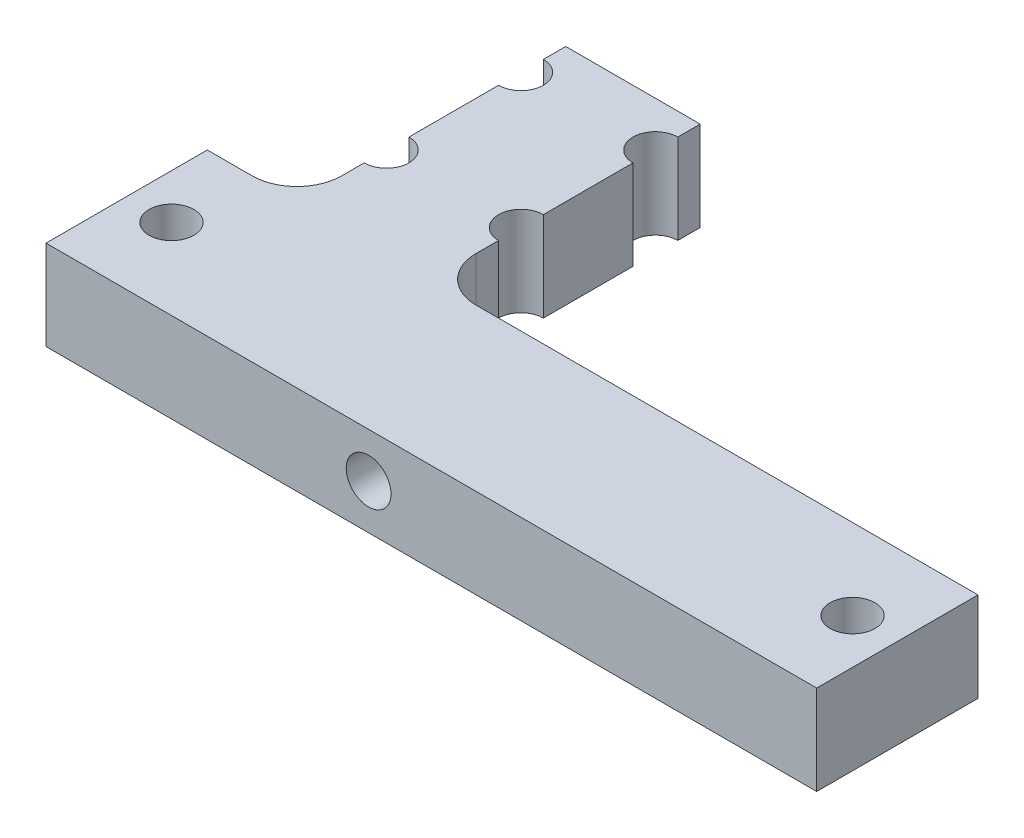
ISO-10303-21;
HEADER;
FILE_DESCRIPTION(('STEP AP214'),'2;1');
FILE_NAME('part.step','',(''),(''),'','','');
FILE_SCHEMA(('AUTOMOTIVE_DESIGN { 1 0 10303 214 1 1 1 1 }'));
ENDSEC;
DATA;
#1=APPLICATION_CONTEXT('core data for automotive mechanical design processes');
#2=APPLICATION_PROTOCOL_DEFINITION('international standard','automotive_design',2000,#1);
#3=PRODUCT_CONTEXT('',#1,'mechanical');
#4=PRODUCT('Part','Part','',(#3));
#5=PRODUCT_RELATED_PRODUCT_CATEGORY('part','',(#4));
#6=PRODUCT_DEFINITION_FORMATION('','',#4);
#7=PRODUCT_DEFINITION_CONTEXT('part definition',#1,'design');
#8=PRODUCT_DEFINITION('design','',#6,#7);
#9=PRODUCT_DEFINITION_SHAPE('','',#8);
#10=(LENGTH_UNIT() NAMED_UNIT(*) SI_UNIT(.MILLI.,.METRE.));
#11=(NAMED_UNIT(*) PLANE_ANGLE_UNIT() SI_UNIT($,.RADIAN.));
#12=(NAMED_UNIT(*) SI_UNIT($,.STERADIAN.) SOLID_ANGLE_UNIT());
#13=UNCERTAINTY_MEASURE_WITH_UNIT(LENGTH_MEASURE(1.E-05),#10,'distance_accuracy_value','');
#14=(GEOMETRIC_REPRESENTATION_CONTEXT(3) GLOBAL_UNCERTAINTY_ASSIGNED_CONTEXT((#13)) GLOBAL_UNIT_ASSIGNED_CONTEXT((#10,
#11,#12)) REPRESENTATION_CONTEXT('',''));
#15=CARTESIAN_POINT('',(0.,0.,0.));
#16=DIRECTION('',(0.,0.,1.));
#17=DIRECTION('',(1.,0.,0.));
#18=AXIS2_PLACEMENT_3D('',#15,#16,#17);
#19=CARTESIAN_POINT('',(-20.955,6.35,-12.065));
#20=DIRECTION('',(0.,1.,0.));
#21=DIRECTION('',(0.,0.,1.));
#22=AXIS2_PLACEMENT_3D('',#19,#20,#21);
#23=PLANE('',#22);
#24=CARTESIAN_POINT('',(-24.13,6.35,0.));
#25=DIRECTION('',(0.,1.,0.));
#26=DIRECTION('',(0.,0.,1.));
#27=AXIS2_PLACEMENT_3D('',#24,#25,#26);
#28=CIRCLE('',#27,1.5875);
#29=CARTESIAN_POINT('',(-24.13,6.35,1.5875));
#30=VERTEX_POINT('',#29);
#31=EDGE_CURVE('E316',#30,#30,#28,.T.);
#32=ORIENTED_EDGE('',*,*,#31,.F.);
#33=EDGE_LOOP('',(#32));
#34=FACE_BOUND('',#33,.T.);
#35=DIRECTION('',(0.,0.,-1.));
#36=VECTOR('',#35,1.);
#37=CARTESIAN_POINT('',(27.305,6.35,-5.715));
#38=LINE('',#37,#36);
#39=CARTESIAN_POINT('',(27.305,6.35,5.715));
#40=VERTEX_POINT('',#39);
#41=CARTESIAN_POINT('',(27.305,6.35,-5.715));
#42=VERTEX_POINT('',#41);
#43=EDGE_CURVE('E163',#40,#42,#38,.T.);
#44=ORIENTED_EDGE('',*,*,#43,.T.);
#45=DIRECTION('',(-1.,0.,0.));
#46=VECTOR('',#45,1.);
#47=CARTESIAN_POINT('',(-11.43,6.35,-5.715));
#48=LINE('',#47,#46);
#49=CARTESIAN_POINT('',(-8.25499999999999,6.35,-5.715));
#50=VERTEX_POINT('',#49);
#51=EDGE_CURVE('E154',#42,#50,#48,.T.);
#52=ORIENTED_EDGE('',*,*,#51,.T.);
#53=CARTESIAN_POINT('',(-8.25499999999999,6.35,-8.89));
#54=DIRECTION('',(0.,1.,0.));
#55=DIRECTION('',(0.,0.,1.));
#56=AXIS2_PLACEMENT_3D('',#53,#54,#55);
#57=CIRCLE('',#56,3.175);
#58=CARTESIAN_POINT('',(-11.43,6.35,-8.89));
#59=VERTEX_POINT('',#58);
#60=EDGE_CURVE('E11',#50,#59,#57,.F.);
#61=ORIENTED_EDGE('',*,*,#60,.T.);
#62=DIRECTION('',(0.,0.,-1.));
#63=VECTOR('',#62,1.);
#64=CARTESIAN_POINT('',(-11.43,6.35,-5.715));
#65=LINE('',#64,#63);
#66=CARTESIAN_POINT('',(-11.43,6.35,-10.4775));
#67=VERTEX_POINT('',#66);
#68=EDGE_CURVE('E162',#59,#67,#65,.T.);
#69=ORIENTED_EDGE('',*,*,#68,.T.);
#70=CARTESIAN_POINT('',(-11.43,6.35,-12.065));
#71=DIRECTION('',(0.,-1.,0.));
#72=DIRECTION('',(0.,0.,1.));
#73=AXIS2_PLACEMENT_3D('',#70,#71,#72);
#74=CIRCLE('',#73,1.5875);
#75=CARTESIAN_POINT('',(-11.43,6.35,-13.6525));
#76=VERTEX_POINT('',#75);
#77=EDGE_CURVE('E323',#67,#76,#74,.T.);
#78=ORIENTED_EDGE('',*,*,#77,.T.);
#79=DIRECTION('',(0.,0.,-1.));
#80=VECTOR('',#79,1.);
#81=CARTESIAN_POINT('',(-11.43,6.35,-13.6525));
#82=LINE('',#81,#80);
#83=CARTESIAN_POINT('',(-11.43,6.35,-20.0025));
#84=VERTEX_POINT('',#83);
#85=EDGE_CURVE('E273',#76,#84,#82,.T.);
#86=ORIENTED_EDGE('',*,*,#85,.T.);
#87=CARTESIAN_POINT('',(-11.43,6.35,-21.59));
#88=DIRECTION('',(0.,-1.,0.));
#89=DIRECTION('',(0.,0.,1.));
#90=AXIS2_PLACEMENT_3D('',#87,#88,#89);
#91=CIRCLE('',#90,1.5875);
#92=CARTESIAN_POINT('',(-11.43,6.35,-23.1775));
#93=VERTEX_POINT('',#92);
#94=EDGE_CURVE('E325',#84,#93,#91,.T.);
#95=ORIENTED_EDGE('',*,*,#94,.T.);
#96=DIRECTION('',(0.,0.,-1.));
#97=VECTOR('',#96,1.);
#98=CARTESIAN_POINT('',(-11.43,6.35,-23.1775));
#99=LINE('',#98,#97);
#100=CARTESIAN_POINT('',(-11.43,6.35,-24.765));
#101=VERTEX_POINT('',#100);
#102=EDGE_CURVE('E330',#93,#101,#99,.T.);
#103=ORIENTED_EDGE('',*,*,#102,.T.);
#104=DIRECTION('',(-1.,0.,0.));
#105=VECTOR('',#104,1.);
#106=CARTESIAN_POINT('',(-20.955,6.35,-24.765));
#107=LINE('',#106,#105);
#108=CARTESIAN_POINT('',(-20.955,6.35,-24.765));
#109=VERTEX_POINT('',#108);
#110=EDGE_CURVE('E332',#101,#109,#107,.T.);
#111=ORIENTED_EDGE('',*,*,#110,.T.);
#112=DIRECTION('',(0.,0.,1.));
#113=VECTOR('',#112,1.);
#114=CARTESIAN_POINT('',(-20.955,6.35,-23.1775));
#115=LINE('',#114,#113);
#116=CARTESIAN_POINT('',(-20.955,6.35,-23.1775));
#117=VERTEX_POINT('',#116);
#118=EDGE_CURVE('E334',#109,#117,#115,.T.);
#119=ORIENTED_EDGE('',*,*,#118,.T.);
#120=CARTESIAN_POINT('',(-20.955,6.35,-21.59));
#121=DIRECTION('',(0.,-1.,0.));
#122=DIRECTION('',(0.,0.,1.));
#123=AXIS2_PLACEMENT_3D('',#120,#121,#122);
#124=CIRCLE('',#123,1.5875);
#125=CARTESIAN_POINT('',(-20.955,6.35,-20.0025));
#126=VERTEX_POINT('',#125);
#127=EDGE_CURVE('E308',#117,#126,#124,.T.);
#128=ORIENTED_EDGE('',*,*,#127,.T.);
#129=DIRECTION('',(0.,0.,1.));
#130=VECTOR('',#129,1.);
#131=CARTESIAN_POINT('',(-20.955,6.35,-13.6525));
#132=LINE('',#131,#130);
#133=CARTESIAN_POINT('',(-20.955,6.35,-13.6525));
#134=VERTEX_POINT('',#133);
#135=EDGE_CURVE('E305',#126,#134,#132,.T.);
#136=ORIENTED_EDGE('',*,*,#135,.T.);
#137=CARTESIAN_POINT('',(-20.955,6.35,-12.065));
#138=DIRECTION('',(0.,-1.,0.));
#139=DIRECTION('',(0.,0.,1.));
#140=AXIS2_PLACEMENT_3D('',#137,#138,#139);
#141=CIRCLE('',#140,1.5875);
#142=CARTESIAN_POINT('',(-20.955,6.35,-10.4775));
#143=VERTEX_POINT('',#142);
#144=EDGE_CURVE('E304',#134,#143,#141,.T.);
#145=ORIENTED_EDGE('',*,*,#144,.T.);
#146=DIRECTION('',(0.,0.,1.));
#147=VECTOR('',#146,1.);
#148=CARTESIAN_POINT('',(-20.955,6.35,-5.715));
#149=LINE('',#148,#147);
#150=CARTESIAN_POINT('',(-20.955,6.35,-8.89));
#151=VERTEX_POINT('',#150);
#152=EDGE_CURVE('E202',#143,#151,#149,.T.);
#153=ORIENTED_EDGE('',*,*,#152,.T.);
#154=CARTESIAN_POINT('',(-24.13,6.35,-8.89));
#155=DIRECTION('',(0.,1.,0.));
#156=DIRECTION('',(0.,0.,1.));
#157=AXIS2_PLACEMENT_3D('',#154,#155,#156);
#158=CIRCLE('',#157,3.175);
#159=CARTESIAN_POINT('',(-24.13,6.35,-5.715));
#160=VERTEX_POINT('',#159);
#161=EDGE_CURVE('E195',#151,#160,#158,.F.);
#162=ORIENTED_EDGE('',*,*,#161,.T.);
#163=DIRECTION('',(-1.,0.,0.));
#164=VECTOR('',#163,1.);
#165=CARTESIAN_POINT('',(-27.305,6.35,-5.715));
#166=LINE('',#165,#164);
#167=CARTESIAN_POINT('',(-27.305,6.35,-5.715));
#168=VERTEX_POINT('',#167);
#169=EDGE_CURVE('E199',#160,#168,#166,.T.);
#170=ORIENTED_EDGE('',*,*,#169,.T.);
#171=DIRECTION('',(0.,0.,1.));
#172=VECTOR('',#171,1.);
#173=CARTESIAN_POINT('',(-27.305,6.35,-5.715));
#174=LINE('',#173,#172);
#175=CARTESIAN_POINT('',(-27.305,6.35,5.715));
#176=VERTEX_POINT('',#175);
#177=EDGE_CURVE('E212',#168,#176,#174,.T.);
#178=ORIENTED_EDGE('',*,*,#177,.T.);
#179=DIRECTION('',(1.,0.,0.));
#180=VECTOR('',#179,1.);
#181=CARTESIAN_POINT('',(-27.305,6.35,5.715));
#182=LINE('',#181,#180);
#183=EDGE_CURVE('E168',#176,#40,#182,.T.);
#184=ORIENTED_EDGE('',*,*,#183,.T.);
#185=EDGE_LOOP('',(#44,#52,#61,#69,#78,#86,#95,#103,#111,#119,#128,#136,#145,#153,#162,#170,
#178,#184));
#186=FACE_BOUND('',#185,.T.);
#187=CARTESIAN_POINT('',(24.13,6.35,0.));
#188=DIRECTION('',(0.,1.,0.));
#189=DIRECTION('',(0.,0.,1.));
#190=AXIS2_PLACEMENT_3D('',#187,#188,#189);
#191=CIRCLE('',#190,1.5875);
#192=CARTESIAN_POINT('',(24.13,6.35,1.5875));
#193=VERTEX_POINT('',#192);
#194=EDGE_CURVE('E563',#193,#193,#191,.T.);
#195=ORIENTED_EDGE('',*,*,#194,.F.);
#196=EDGE_LOOP('',(#195));
#197=FACE_BOUND('',#196,.T.);
#198=ADVANCED_FACE('F33',(#34,#186,#197),#23,.T.);
#199=CARTESIAN_POINT('',(-20.955,0.,-12.065));
#200=DIRECTION('',(0.,1.,0.));
#201=DIRECTION('',(0.,0.,1.));
#202=AXIS2_PLACEMENT_3D('',#199,#200,#201);
#203=PLANE('',#202);
#204=CARTESIAN_POINT('',(-24.13,0.,0.));
#205=DIRECTION('',(0.,1.,0.));
#206=DIRECTION('',(0.,0.,1.));
#207=AXIS2_PLACEMENT_3D('',#204,#205,#206);
#208=CIRCLE('',#207,1.5875);
#209=CARTESIAN_POINT('',(-24.13,0.,1.5875));
#210=VERTEX_POINT('',#209);
#211=EDGE_CURVE('E566',#210,#210,#208,.T.);
#212=ORIENTED_EDGE('',*,*,#211,.T.);
#213=EDGE_LOOP('',(#212));
#214=FACE_BOUND('',#213,.T.);
#215=DIRECTION('',(0.,0.,-1.));
#216=VECTOR('',#215,1.);
#217=CARTESIAN_POINT('',(27.305,0.,-5.715));
#218=LINE('',#217,#216);
#219=CARTESIAN_POINT('',(27.305,0.,5.715));
#220=VERTEX_POINT('',#219);
#221=CARTESIAN_POINT('',(27.305,0.,-5.715));
#222=VERTEX_POINT('',#221);
#223=EDGE_CURVE('E176',#220,#222,#218,.T.);
#224=ORIENTED_EDGE('',*,*,#223,.F.);
#225=DIRECTION('',(1.,0.,0.));
#226=VECTOR('',#225,1.);
#227=CARTESIAN_POINT('',(-27.305,0.,5.715));
#228=LINE('',#227,#226);
#229=CARTESIAN_POINT('',(-27.305,0.,5.715));
#230=VERTEX_POINT('',#229);
#231=EDGE_CURVE('E172',#230,#220,#228,.T.);
#232=ORIENTED_EDGE('',*,*,#231,.F.);
#233=DIRECTION('',(0.,0.,1.));
#234=VECTOR('',#233,1.);
#235=CARTESIAN_POINT('',(-27.305,0.,-5.715));
#236=LINE('',#235,#234);
#237=CARTESIAN_POINT('',(-27.305,0.,-5.715));
#238=VERTEX_POINT('',#237);
#239=EDGE_CURVE('E230',#238,#230,#236,.T.);
#240=ORIENTED_EDGE('',*,*,#239,.F.);
#241=DIRECTION('',(-1.,0.,0.));
#242=VECTOR('',#241,1.);
#243=CARTESIAN_POINT('',(-27.305,0.,-5.715));
#244=LINE('',#243,#242);
#245=CARTESIAN_POINT('',(-24.13,0.,-5.715));
#246=VERTEX_POINT('',#245);
#247=EDGE_CURVE('E222',#246,#238,#244,.T.);
#248=ORIENTED_EDGE('',*,*,#247,.F.);
#249=CARTESIAN_POINT('',(-24.13,0.,-8.89));
#250=DIRECTION('',(0.,1.,0.));
#251=DIRECTION('',(0.,0.,1.));
#252=AXIS2_PLACEMENT_3D('',#249,#250,#251);
#253=CIRCLE('',#252,3.175);
#254=CARTESIAN_POINT('',(-20.955,0.,-8.89));
#255=VERTEX_POINT('',#254);
#256=EDGE_CURVE('E193',#246,#255,#253,.T.);
#257=ORIENTED_EDGE('',*,*,#256,.T.);
#258=DIRECTION('',(0.,0.,1.));
#259=VECTOR('',#258,1.);
#260=CARTESIAN_POINT('',(-20.955,0.,-5.715));
#261=LINE('',#260,#259);
#262=CARTESIAN_POINT('',(-20.955,0.,-10.4775));
#263=VERTEX_POINT('',#262);
#264=EDGE_CURVE('E220',#263,#255,#261,.T.);
#265=ORIENTED_EDGE('',*,*,#264,.F.);
#266=CARTESIAN_POINT('',(-20.955,0.,-12.065));
#267=DIRECTION('',(0.,-1.,0.));
#268=DIRECTION('',(0.,0.,1.));
#269=AXIS2_PLACEMENT_3D('',#266,#267,#268);
#270=CIRCLE('',#269,1.5875);
#271=CARTESIAN_POINT('',(-20.955,0.,-13.6525));
#272=VERTEX_POINT('',#271);
#273=EDGE_CURVE('E228',#272,#263,#270,.T.);
#274=ORIENTED_EDGE('',*,*,#273,.F.);
#275=DIRECTION('',(0.,0.,1.));
#276=VECTOR('',#275,1.);
#277=CARTESIAN_POINT('',(-20.955,0.,-13.6525));
#278=LINE('',#277,#276);
#279=CARTESIAN_POINT('',(-20.955,0.,-20.0025));
#280=VERTEX_POINT('',#279);
#281=EDGE_CURVE('E232',#280,#272,#278,.T.);
#282=ORIENTED_EDGE('',*,*,#281,.F.);
#283=CARTESIAN_POINT('',(-20.955,0.,-21.59));
#284=DIRECTION('',(0.,-1.,0.));
#285=DIRECTION('',(0.,0.,1.));
#286=AXIS2_PLACEMENT_3D('',#283,#284,#285);
#287=CIRCLE('',#286,1.5875);
#288=CARTESIAN_POINT('',(-20.955,0.,-23.1775));
#289=VERTEX_POINT('',#288);
#290=EDGE_CURVE('E293',#289,#280,#287,.T.);
#291=ORIENTED_EDGE('',*,*,#290,.F.);
#292=DIRECTION('',(0.,0.,1.));
#293=VECTOR('',#292,1.);
#294=CARTESIAN_POINT('',(-20.955,0.,-23.1775));
#295=LINE('',#294,#293);
#296=CARTESIAN_POINT('',(-20.955,0.,-24.765));
#297=VERTEX_POINT('',#296);
#298=EDGE_CURVE('E291',#297,#289,#295,.T.);
#299=ORIENTED_EDGE('',*,*,#298,.F.);
#300=DIRECTION('',(-1.,0.,0.));
#301=VECTOR('',#300,1.);
#302=CARTESIAN_POINT('',(-20.955,0.,-24.765));
#303=LINE('',#302,#301);
#304=CARTESIAN_POINT('',(-11.43,0.,-24.765));
#305=VERTEX_POINT('',#304);
#306=EDGE_CURVE('E289',#305,#297,#303,.T.);
#307=ORIENTED_EDGE('',*,*,#306,.F.);
#308=DIRECTION('',(0.,0.,-1.));
#309=VECTOR('',#308,1.);
#310=CARTESIAN_POINT('',(-11.43,0.,-23.1775));
#311=LINE('',#310,#309);
#312=CARTESIAN_POINT('',(-11.43,0.,-23.1775));
#313=VERTEX_POINT('',#312);
#314=EDGE_CURVE('E282',#313,#305,#311,.T.);
#315=ORIENTED_EDGE('',*,*,#314,.F.);
#316=CARTESIAN_POINT('',(-11.43,0.,-21.59));
#317=DIRECTION('',(0.,-1.,0.));
#318=DIRECTION('',(0.,0.,1.));
#319=AXIS2_PLACEMENT_3D('',#316,#317,#318);
#320=CIRCLE('',#319,1.5875);
#321=CARTESIAN_POINT('',(-11.43,0.,-20.0025));
#322=VERTEX_POINT('',#321);
#323=EDGE_CURVE('E280',#322,#313,#320,.T.);
#324=ORIENTED_EDGE('',*,*,#323,.F.);
#325=DIRECTION('',(0.,0.,-1.));
#326=VECTOR('',#325,1.);
#327=CARTESIAN_POINT('',(-11.43,0.,-13.6525));
#328=LINE('',#327,#326);
#329=CARTESIAN_POINT('',(-11.43,0.,-13.6525));
#330=VERTEX_POINT('',#329);
#331=EDGE_CURVE('E272',#330,#322,#328,.T.);
#332=ORIENTED_EDGE('',*,*,#331,.F.);
#333=CARTESIAN_POINT('',(-11.43,0.,-12.065));
#334=DIRECTION('',(0.,-1.,0.));
#335=DIRECTION('',(0.,0.,1.));
#336=AXIS2_PLACEMENT_3D('',#333,#334,#335);
#337=CIRCLE('',#336,1.5875);
#338=CARTESIAN_POINT('',(-11.43,0.,-10.4775));
#339=VERTEX_POINT('',#338);
#340=EDGE_CURVE('E278',#339,#330,#337,.T.);
#341=ORIENTED_EDGE('',*,*,#340,.F.);
#342=DIRECTION('',(0.,0.,-1.));
#343=VECTOR('',#342,1.);
#344=CARTESIAN_POINT('',(-11.43,0.,-5.715));
#345=LINE('',#344,#343);
#346=CARTESIAN_POINT('',(-11.43,0.,-8.89));
#347=VERTEX_POINT('',#346);
#348=EDGE_CURVE('E284',#347,#339,#345,.T.);
#349=ORIENTED_EDGE('',*,*,#348,.F.);
#350=CARTESIAN_POINT('',(-8.25499999999999,0.,-8.89));
#351=DIRECTION('',(0.,1.,0.));
#352=DIRECTION('',(0.,0.,1.));
#353=AXIS2_PLACEMENT_3D('',#350,#351,#352);
#354=CIRCLE('',#353,3.175);
#355=CARTESIAN_POINT('',(-8.25499999999999,0.,-5.715));
#356=VERTEX_POINT('',#355);
#357=EDGE_CURVE('E41',#347,#356,#354,.T.);
#358=ORIENTED_EDGE('',*,*,#357,.T.);
#359=DIRECTION('',(-1.,0.,0.));
#360=VECTOR('',#359,1.);
#361=CARTESIAN_POINT('',(-11.43,0.,-5.715));
#362=LINE('',#361,#360);
#363=EDGE_CURVE('E315',#222,#356,#362,.T.);
#364=ORIENTED_EDGE('',*,*,#363,.F.);
#365=EDGE_LOOP('',(#224,#232,#240,#248,#257,#265,#274,#282,#291,#299,#307,#315,#324,#332,#341,
#349,#358,#364));
#366=FACE_BOUND('',#365,.T.);
#367=CARTESIAN_POINT('',(24.13,0.,0.));
#368=DIRECTION('',(0.,1.,0.));
#369=DIRECTION('',(0.,0.,1.));
#370=AXIS2_PLACEMENT_3D('',#367,#368,#369);
#371=CIRCLE('',#370,1.5875);
#372=CARTESIAN_POINT('',(24.13,0.,1.5875));
#373=VERTEX_POINT('',#372);
#374=EDGE_CURVE('E560',#373,#373,#371,.T.);
#375=ORIENTED_EDGE('',*,*,#374,.T.);
#376=EDGE_LOOP('',(#375));
#377=FACE_BOUND('',#376,.T.);
#378=ADVANCED_FACE('F217',(#214,#366,#377),#203,.F.);
#379=CARTESIAN_POINT('',(27.305,6.35,-5.715));
#380=DIRECTION('',(-1.,0.,0.));
#381=DIRECTION('',(0.,0.,1.));
#382=AXIS2_PLACEMENT_3D('',#379,#380,#381);
#383=PLANE('',#382);
#384=ORIENTED_EDGE('',*,*,#223,.T.);
#385=DIRECTION('',(0.,-1.,0.));
#386=VECTOR('',#385,1.);
#387=CARTESIAN_POINT('',(27.305,6.35,-5.715));
#388=LINE('',#387,#386);
#389=EDGE_CURVE('E158',#42,#222,#388,.T.);
#390=ORIENTED_EDGE('',*,*,#389,.F.);
#391=ORIENTED_EDGE('',*,*,#43,.F.);
#392=DIRECTION('',(0.,-1.,0.));
#393=VECTOR('',#392,1.);
#394=CARTESIAN_POINT('',(27.305,6.35,5.715));
#395=LINE('',#394,#393);
#396=EDGE_CURVE('E238',#40,#220,#395,.T.);
#397=ORIENTED_EDGE('',*,*,#396,.T.);
#398=EDGE_LOOP('',(#384,#390,#391,#397));
#399=FACE_BOUND('',#398,.T.);
#400=ADVANCED_FACE('F174',(#399),#383,.F.);
#401=CARTESIAN_POINT('',(-11.43,6.35,-5.715));
#402=DIRECTION('',(0.,0.,1.));
#403=DIRECTION('',(1.,0.,0.));
#404=AXIS2_PLACEMENT_3D('',#401,#402,#403);
#405=PLANE('',#404);
#406=CARTESIAN_POINT('',(-4.44499999999999,3.175,-5.715));
#407=DIRECTION('',(0.,0.,-1.));
#408=DIRECTION('',(-1.,0.,0.));
#409=AXIS2_PLACEMENT_3D('',#406,#407,#408);
#410=CIRCLE('',#409,1.5875);
#411=CARTESIAN_POINT('',(-6.03249999999999,3.175,-5.715));
#412=VERTEX_POINT('',#411);
#413=EDGE_CURVE('E555',#412,#412,#410,.T.);
#414=ORIENTED_EDGE('',*,*,#413,.F.);
#415=EDGE_LOOP('',(#414));
#416=FACE_BOUND('',#415,.T.);
#417=ORIENTED_EDGE('',*,*,#363,.T.);
#418=DIRECTION('',(0.,-1.,0.));
#419=VECTOR('',#418,1.);
#420=CARTESIAN_POINT('',(-8.25499999999999,6.35,-5.715));
#421=LINE('',#420,#419);
#422=EDGE_CURVE('E48',#356,#50,#421,.F.);
#423=ORIENTED_EDGE('',*,*,#422,.T.);
#424=ORIENTED_EDGE('',*,*,#51,.F.);
#425=ORIENTED_EDGE('',*,*,#389,.T.);
#426=EDGE_LOOP('',(#417,#423,#424,#425));
#427=FACE_BOUND('',#426,.T.);
#428=ADVANCED_FACE('F156',(#416,#427),#405,.F.);
#429=CARTESIAN_POINT('',(-11.43,6.35,-5.715));
#430=DIRECTION('',(-1.,0.,0.));
#431=DIRECTION('',(0.,0.,1.));
#432=AXIS2_PLACEMENT_3D('',#429,#430,#431);
#433=PLANE('',#432);
#434=ORIENTED_EDGE('',*,*,#68,.F.);
#435=DIRECTION('',(0.,-1.,0.));
#436=VECTOR('',#435,1.);
#437=CARTESIAN_POINT('',(-11.43,0.,-8.89));
#438=LINE('',#437,#436);
#439=EDGE_CURVE('E189',#59,#347,#438,.T.);
#440=ORIENTED_EDGE('',*,*,#439,.T.);
#441=ORIENTED_EDGE('',*,*,#348,.T.);
#442=DIRECTION('',(0.,-1.,0.));
#443=VECTOR('',#442,1.);
#444=CARTESIAN_POINT('',(-11.43,6.35,-10.4775));
#445=LINE('',#444,#443);
#446=EDGE_CURVE('E178',#67,#339,#445,.T.);
#447=ORIENTED_EDGE('',*,*,#446,.F.);
#448=EDGE_LOOP('',(#434,#440,#441,#447));
#449=FACE_BOUND('',#448,.T.);
#450=ADVANCED_FACE('F320',(#449),#433,.F.);
#451=CARTESIAN_POINT('',(-11.43,6.35,-12.065));
#452=DIRECTION('',(0.,-1.,0.));
#453=DIRECTION('',(0.,0.,-1.));
#454=AXIS2_PLACEMENT_3D('',#451,#452,#453);
#455=CYLINDRICAL_SURFACE('',#454,1.5875);
#456=ORIENTED_EDGE('',*,*,#340,.T.);
#457=DIRECTION('',(0.,-1.,0.));
#458=VECTOR('',#457,1.);
#459=CARTESIAN_POINT('',(-11.43,6.35,-13.6525));
#460=LINE('',#459,#458);
#461=EDGE_CURVE('E184',#76,#330,#460,.T.);
#462=ORIENTED_EDGE('',*,*,#461,.F.);
#463=ORIENTED_EDGE('',*,*,#77,.F.);
#464=ORIENTED_EDGE('',*,*,#446,.T.);
#465=EDGE_LOOP('',(#456,#462,#463,#464));
#466=FACE_BOUND('',#465,.T.);
#467=ADVANCED_FACE('F322',(#466),#455,.F.);
#468=CARTESIAN_POINT('',(-11.43,6.35,-13.6525));
#469=DIRECTION('',(-1.,0.,0.));
#470=DIRECTION('',(0.,0.,1.));
#471=AXIS2_PLACEMENT_3D('',#468,#469,#470);
#472=PLANE('',#471);
#473=ORIENTED_EDGE('',*,*,#331,.T.);
#474=DIRECTION('',(0.,-1.,0.));
#475=VECTOR('',#474,1.);
#476=CARTESIAN_POINT('',(-11.43,6.35,-20.0025));
#477=LINE('',#476,#475);
#478=EDGE_CURVE('E263',#84,#322,#477,.T.);
#479=ORIENTED_EDGE('',*,*,#478,.F.);
#480=ORIENTED_EDGE('',*,*,#85,.F.);
#481=ORIENTED_EDGE('',*,*,#461,.T.);
#482=EDGE_LOOP('',(#473,#479,#480,#481));
#483=FACE_BOUND('',#482,.T.);
#484=ADVANCED_FACE('F270',(#483),#472,.F.);
#485=CARTESIAN_POINT('',(-11.43,6.35,-21.59));
#486=DIRECTION('',(0.,-1.,0.));
#487=DIRECTION('',(0.,0.,-1.));
#488=AXIS2_PLACEMENT_3D('',#485,#486,#487);
#489=CYLINDRICAL_SURFACE('',#488,1.5875);
#490=ORIENTED_EDGE('',*,*,#323,.T.);
#491=DIRECTION('',(0.,-1.,0.));
#492=VECTOR('',#491,1.);
#493=CARTESIAN_POINT('',(-11.43,6.35,-23.1775));
#494=LINE('',#493,#492);
#495=EDGE_CURVE('E260',#93,#313,#494,.T.);
#496=ORIENTED_EDGE('',*,*,#495,.F.);
#497=ORIENTED_EDGE('',*,*,#94,.F.);
#498=ORIENTED_EDGE('',*,*,#478,.T.);
#499=EDGE_LOOP('',(#490,#496,#497,#498));
#500=FACE_BOUND('',#499,.T.);
#501=ADVANCED_FACE('F355',(#500),#489,.F.);
#502=CARTESIAN_POINT('',(-11.43,6.35,-23.1775));
#503=DIRECTION('',(-1.,0.,0.));
#504=DIRECTION('',(0.,0.,1.));
#505=AXIS2_PLACEMENT_3D('',#502,#503,#504);
#506=PLANE('',#505);
#507=ORIENTED_EDGE('',*,*,#314,.T.);
#508=DIRECTION('',(0.,-1.,0.));
#509=VECTOR('',#508,1.);
#510=CARTESIAN_POINT('',(-11.43,6.35,-24.765));
#511=LINE('',#510,#509);
#512=EDGE_CURVE('E257',#101,#305,#511,.T.);
#513=ORIENTED_EDGE('',*,*,#512,.F.);
#514=ORIENTED_EDGE('',*,*,#102,.F.);
#515=ORIENTED_EDGE('',*,*,#495,.T.);
#516=EDGE_LOOP('',(#507,#513,#514,#515));
#517=FACE_BOUND('',#516,.T.);
#518=ADVANCED_FACE('F351',(#517),#506,.F.);
#519=CARTESIAN_POINT('',(-20.955,6.35,-24.765));
#520=DIRECTION('',(0.,0.,1.));
#521=DIRECTION('',(1.,0.,0.));
#522=AXIS2_PLACEMENT_3D('',#519,#520,#521);
#523=PLANE('',#522);
#524=ORIENTED_EDGE('',*,*,#306,.T.);
#525=DIRECTION('',(0.,-1.,0.));
#526=VECTOR('',#525,1.);
#527=CARTESIAN_POINT('',(-20.955,6.35,-24.765));
#528=LINE('',#527,#526);
#529=EDGE_CURVE('E254',#109,#297,#528,.T.);
#530=ORIENTED_EDGE('',*,*,#529,.F.);
#531=ORIENTED_EDGE('',*,*,#110,.F.);
#532=ORIENTED_EDGE('',*,*,#512,.T.);
#533=EDGE_LOOP('',(#524,#530,#531,#532));
#534=FACE_BOUND('',#533,.T.);
#535=ADVANCED_FACE('F347',(#534),#523,.F.);
#536=CARTESIAN_POINT('',(-20.955,6.35,-23.1775));
#537=DIRECTION('',(1.,0.,0.));
#538=DIRECTION('',(0.,0.,-1.));
#539=AXIS2_PLACEMENT_3D('',#536,#537,#538);
#540=PLANE('',#539);
#541=ORIENTED_EDGE('',*,*,#298,.T.);
#542=DIRECTION('',(0.,-1.,0.));
#543=VECTOR('',#542,1.);
#544=CARTESIAN_POINT('',(-20.955,6.35,-23.1775));
#545=LINE('',#544,#543);
#546=EDGE_CURVE('E251',#117,#289,#545,.T.);
#547=ORIENTED_EDGE('',*,*,#546,.F.);
#548=ORIENTED_EDGE('',*,*,#118,.F.);
#549=ORIENTED_EDGE('',*,*,#529,.T.);
#550=EDGE_LOOP('',(#541,#547,#548,#549));
#551=FACE_BOUND('',#550,.T.);
#552=ADVANCED_FACE('F343',(#551),#540,.F.);
#553=CARTESIAN_POINT('',(-20.955,6.35,-21.59));
#554=DIRECTION('',(0.,-1.,0.));
#555=DIRECTION('',(0.,0.,-1.));
#556=AXIS2_PLACEMENT_3D('',#553,#554,#555);
#557=CYLINDRICAL_SURFACE('',#556,1.5875);
#558=ORIENTED_EDGE('',*,*,#290,.T.);
#559=DIRECTION('',(0.,-1.,0.));
#560=VECTOR('',#559,1.);
#561=CARTESIAN_POINT('',(-20.955,6.35,-20.0025));
#562=LINE('',#561,#560);
#563=EDGE_CURVE('E248',#126,#280,#562,.T.);
#564=ORIENTED_EDGE('',*,*,#563,.F.);
#565=ORIENTED_EDGE('',*,*,#127,.F.);
#566=ORIENTED_EDGE('',*,*,#546,.T.);
#567=EDGE_LOOP('',(#558,#564,#565,#566));
#568=FACE_BOUND('',#567,.T.);
#569=ADVANCED_FACE('F339',(#568),#557,.F.);
#570=CARTESIAN_POINT('',(-20.955,6.35,-13.6525));
#571=DIRECTION('',(1.,0.,0.));
#572=DIRECTION('',(0.,0.,-1.));
#573=AXIS2_PLACEMENT_3D('',#570,#571,#572);
#574=PLANE('',#573);
#575=ORIENTED_EDGE('',*,*,#281,.T.);
#576=DIRECTION('',(0.,-1.,0.));
#577=VECTOR('',#576,1.);
#578=CARTESIAN_POINT('',(-20.955,6.35,-13.6525));
#579=LINE('',#578,#577);
#580=EDGE_CURVE('E245',#134,#272,#579,.T.);
#581=ORIENTED_EDGE('',*,*,#580,.F.);
#582=ORIENTED_EDGE('',*,*,#135,.F.);
#583=ORIENTED_EDGE('',*,*,#563,.T.);
#584=EDGE_LOOP('',(#575,#581,#582,#583));
#585=FACE_BOUND('',#584,.T.);
#586=ADVANCED_FACE('F297',(#585),#574,.F.);
#587=CARTESIAN_POINT('',(-20.955,6.35,-12.065));
#588=DIRECTION('',(0.,-1.,0.));
#589=DIRECTION('',(0.,0.,-1.));
#590=AXIS2_PLACEMENT_3D('',#587,#588,#589);
#591=CYLINDRICAL_SURFACE('',#590,1.5875);
#592=ORIENTED_EDGE('',*,*,#273,.T.);
#593=DIRECTION('',(0.,-1.,0.));
#594=VECTOR('',#593,1.);
#595=CARTESIAN_POINT('',(-20.955,6.35,-10.4775));
#596=LINE('',#595,#594);
#597=EDGE_CURVE('E227',#143,#263,#596,.T.);
#598=ORIENTED_EDGE('',*,*,#597,.F.);
#599=ORIENTED_EDGE('',*,*,#144,.F.);
#600=ORIENTED_EDGE('',*,*,#580,.T.);
#601=EDGE_LOOP('',(#592,#598,#599,#600));
#602=FACE_BOUND('',#601,.T.);
#603=ADVANCED_FACE('F303',(#602),#591,.F.);
#604=CARTESIAN_POINT('',(-20.955,6.35,-5.715));
#605=DIRECTION('',(1.,0.,0.));
#606=DIRECTION('',(0.,0.,-1.));
#607=AXIS2_PLACEMENT_3D('',#604,#605,#606);
#608=PLANE('',#607);
#609=ORIENTED_EDGE('',*,*,#264,.T.);
#610=DIRECTION('',(0.,-1.,0.));
#611=VECTOR('',#610,1.);
#612=CARTESIAN_POINT('',(-20.955,6.35,-8.89));
#613=LINE('',#612,#611);
#614=EDGE_CURVE('E181',#255,#151,#613,.F.);
#615=ORIENTED_EDGE('',*,*,#614,.T.);
#616=ORIENTED_EDGE('',*,*,#152,.F.);
#617=ORIENTED_EDGE('',*,*,#597,.T.);
#618=EDGE_LOOP('',(#609,#615,#616,#617));
#619=FACE_BOUND('',#618,.T.);
#620=ADVANCED_FACE('F225',(#619),#608,.F.);
#621=CARTESIAN_POINT('',(-27.305,6.35,-5.715));
#622=DIRECTION('',(0.,0.,1.));
#623=DIRECTION('',(1.,0.,0.));
#624=AXIS2_PLACEMENT_3D('',#621,#622,#623);
#625=PLANE('',#624);
#626=ORIENTED_EDGE('',*,*,#169,.F.);
#627=DIRECTION('',(0.,-1.,0.));
#628=VECTOR('',#627,1.);
#629=CARTESIAN_POINT('',(-24.13,0.,-5.715));
#630=LINE('',#629,#628);
#631=EDGE_CURVE('E177',#160,#246,#630,.T.);
#632=ORIENTED_EDGE('',*,*,#631,.T.);
#633=ORIENTED_EDGE('',*,*,#247,.T.);
#634=DIRECTION('',(0.,-1.,0.));
#635=VECTOR('',#634,1.);
#636=CARTESIAN_POINT('',(-27.305,6.35,-5.715));
#637=LINE('',#636,#635);
#638=EDGE_CURVE('E210',#168,#238,#637,.T.);
#639=ORIENTED_EDGE('',*,*,#638,.F.);
#640=EDGE_LOOP('',(#626,#632,#633,#639));
#641=FACE_BOUND('',#640,.T.);
#642=ADVANCED_FACE('F207',(#641),#625,.F.);
#643=CARTESIAN_POINT('',(-27.305,6.35,-5.715));
#644=DIRECTION('',(1.,0.,0.));
#645=DIRECTION('',(0.,0.,-1.));
#646=AXIS2_PLACEMENT_3D('',#643,#644,#645);
#647=PLANE('',#646);
#648=ORIENTED_EDGE('',*,*,#239,.T.);
#649=DIRECTION('',(0.,-1.,0.));
#650=VECTOR('',#649,1.);
#651=CARTESIAN_POINT('',(-27.305,6.35,5.715));
#652=LINE('',#651,#650);
#653=EDGE_CURVE('E240',#176,#230,#652,.T.);
#654=ORIENTED_EDGE('',*,*,#653,.F.);
#655=ORIENTED_EDGE('',*,*,#177,.F.);
#656=ORIENTED_EDGE('',*,*,#638,.T.);
#657=EDGE_LOOP('',(#648,#654,#655,#656));
#658=FACE_BOUND('',#657,.T.);
#659=ADVANCED_FACE('F380',(#658),#647,.F.);
#660=CARTESIAN_POINT('',(-27.305,6.35,5.715));
#661=DIRECTION('',(0.,0.,-1.));
#662=DIRECTION('',(-1.,0.,0.));
#663=AXIS2_PLACEMENT_3D('',#660,#661,#662);
#664=PLANE('',#663);
#665=CARTESIAN_POINT('',(-4.44499999999999,3.175,5.715));
#666=DIRECTION('',(0.,0.,-1.));
#667=DIRECTION('',(-1.,0.,0.));
#668=AXIS2_PLACEMENT_3D('',#665,#666,#667);
#669=CIRCLE('',#668,1.5875);
#670=CARTESIAN_POINT('',(-6.03249999999999,3.175,5.715));
#671=VERTEX_POINT('',#670);
#672=EDGE_CURVE('E557',#671,#671,#669,.T.);
#673=ORIENTED_EDGE('',*,*,#672,.T.);
#674=EDGE_LOOP('',(#673));
#675=FACE_BOUND('',#674,.T.);
#676=ORIENTED_EDGE('',*,*,#231,.T.);
#677=ORIENTED_EDGE('',*,*,#396,.F.);
#678=ORIENTED_EDGE('',*,*,#183,.F.);
#679=ORIENTED_EDGE('',*,*,#653,.T.);
#680=EDGE_LOOP('',(#676,#677,#678,#679));
#681=FACE_BOUND('',#680,.T.);
#682=ADVANCED_FACE('F377',(#675,#681),#664,.F.);
#683=CARTESIAN_POINT('',(-24.13,6.35,0.));
#684=DIRECTION('',(0.,-1.,0.));
#685=DIRECTION('',(0.,0.,-1.));
#686=AXIS2_PLACEMENT_3D('',#683,#684,#685);
#687=CYLINDRICAL_SURFACE('',#686,1.5875);
#688=ORIENTED_EDGE('',*,*,#31,.T.);
#689=EDGE_LOOP('',(#688));
#690=FACE_BOUND('',#689,.T.);
#691=ORIENTED_EDGE('',*,*,#211,.F.);
#692=EDGE_LOOP('',(#691));
#693=FACE_BOUND('',#692,.T.);
#694=ADVANCED_FACE('F374',(#690,#693),#687,.F.);
#695=CARTESIAN_POINT('',(24.13,6.35,0.));
#696=DIRECTION('',(0.,-1.,0.));
#697=DIRECTION('',(0.,0.,-1.));
#698=AXIS2_PLACEMENT_3D('',#695,#696,#697);
#699=CYLINDRICAL_SURFACE('',#698,1.5875);
#700=ORIENTED_EDGE('',*,*,#194,.T.);
#701=EDGE_LOOP('',(#700));
#702=FACE_BOUND('',#701,.T.);
#703=ORIENTED_EDGE('',*,*,#374,.F.);
#704=EDGE_LOOP('',(#703));
#705=FACE_BOUND('',#704,.T.);
#706=ADVANCED_FACE('F444',(#702,#705),#699,.F.);
#707=CARTESIAN_POINT('',(-24.13,6.35,-8.89));
#708=DIRECTION('',(0.,1.,0.));
#709=DIRECTION('',(0.,0.,1.));
#710=AXIS2_PLACEMENT_3D('',#707,#708,#709);
#711=CYLINDRICAL_SURFACE('',#710,3.175);
#712=ORIENTED_EDGE('',*,*,#161,.F.);
#713=ORIENTED_EDGE('',*,*,#614,.F.);
#714=ORIENTED_EDGE('',*,*,#256,.F.);
#715=ORIENTED_EDGE('',*,*,#631,.F.);
#716=EDGE_LOOP('',(#712,#713,#714,#715));
#717=FACE_BOUND('',#716,.T.);
#718=ADVANCED_FACE('F214',(#717),#711,.F.);
#719=CARTESIAN_POINT('',(-8.25499999999999,6.35,-8.89));
#720=DIRECTION('',(0.,1.,0.));
#721=DIRECTION('',(0.,0.,1.));
#722=AXIS2_PLACEMENT_3D('',#719,#720,#721);
#723=CYLINDRICAL_SURFACE('',#722,3.175);
#724=ORIENTED_EDGE('',*,*,#60,.F.);
#725=ORIENTED_EDGE('',*,*,#422,.F.);
#726=ORIENTED_EDGE('',*,*,#357,.F.);
#727=ORIENTED_EDGE('',*,*,#439,.F.);
#728=EDGE_LOOP('',(#724,#725,#726,#727));
#729=FACE_BOUND('',#728,.T.);
#730=ADVANCED_FACE('F35',(#729),#723,.F.);
#731=CARTESIAN_POINT('',(-4.44499999999999,3.175,5.715));
#732=DIRECTION('',(0.,0.,-1.));
#733=DIRECTION('',(-1.,0.,0.));
#734=AXIS2_PLACEMENT_3D('',#731,#732,#733);
#735=CYLINDRICAL_SURFACE('',#734,1.5875);
#736=ORIENTED_EDGE('',*,*,#672,.F.);
#737=EDGE_LOOP('',(#736));
#738=FACE_BOUND('',#737,.T.);
#739=ORIENTED_EDGE('',*,*,#413,.T.);
#740=EDGE_LOOP('',(#739));
#741=FACE_BOUND('',#740,.T.);
#742=ADVANCED_FACE('F461',(#738,#741),#735,.F.);
#743=CLOSED_SHELL('',(#198,#378,#400,#428,#450,#467,#484,#501,#518,#535,#552,#569,#586,#603,
#620,#642,#659,#682,#694,#706,#718,#730,#742));
#744=MANIFOLD_SOLID_BREP('B2',#743);
#745=ADVANCED_BREP_SHAPE_REPRESENTATION('',(#18,#744),#14);
#746=SHAPE_DEFINITION_REPRESENTATION(#9,#745);
ENDSEC;
END-ISO-10303-21;
